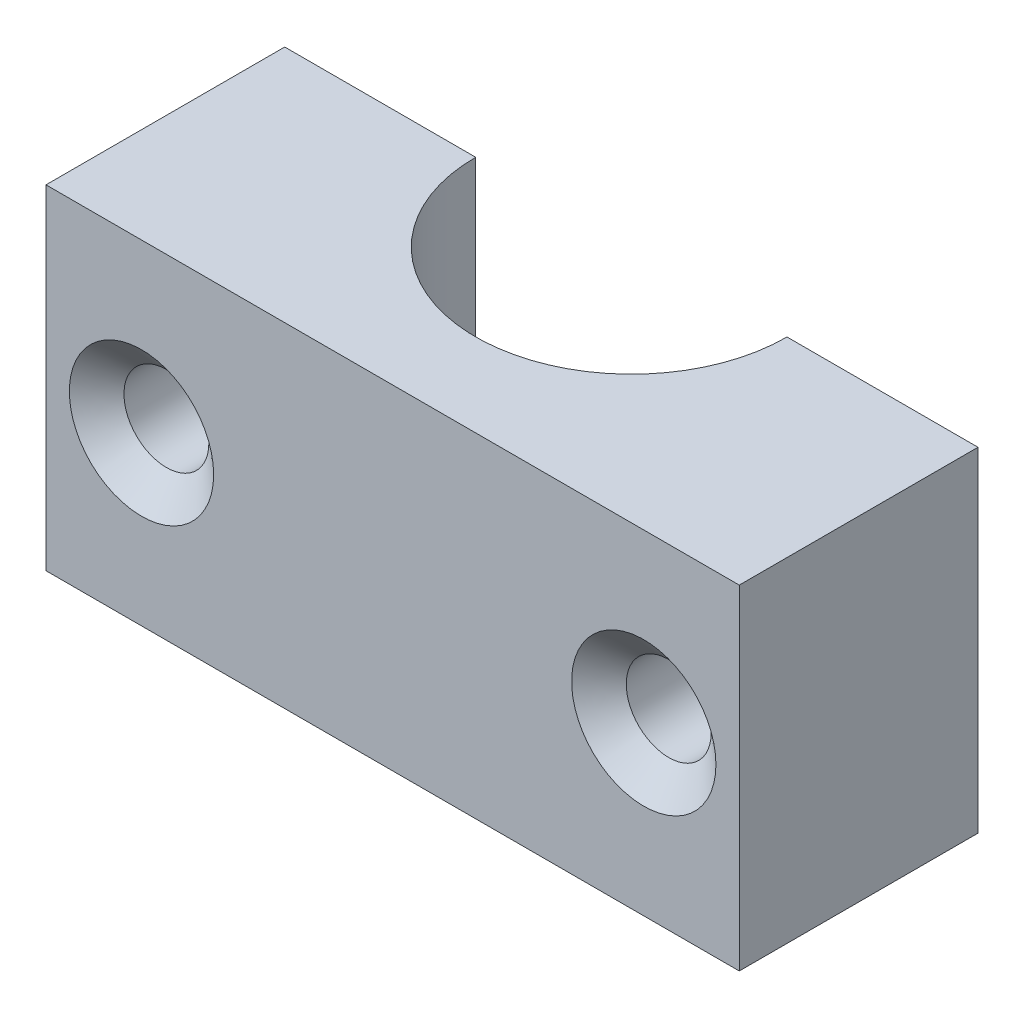
ISO-10303-21;
HEADER;
FILE_DESCRIPTION(('STEP AP214'),'2;1');
FILE_NAME('part.step','',(''),(''),'','','');
FILE_SCHEMA(('AUTOMOTIVE_DESIGN { 1 0 10303 214 1 1 1 1 }'));
ENDSEC;
DATA;
#1=APPLICATION_CONTEXT('core data for automotive mechanical design processes');
#2=APPLICATION_PROTOCOL_DEFINITION('international standard','automotive_design',2000,#1);
#3=PRODUCT_CONTEXT('',#1,'mechanical');
#4=PRODUCT('Part','Part','',(#3));
#5=PRODUCT_RELATED_PRODUCT_CATEGORY('part','',(#4));
#6=PRODUCT_DEFINITION_FORMATION('','',#4);
#7=PRODUCT_DEFINITION_CONTEXT('part definition',#1,'design');
#8=PRODUCT_DEFINITION('design','',#6,#7);
#9=PRODUCT_DEFINITION_SHAPE('','',#8);
#10=(LENGTH_UNIT() NAMED_UNIT(*) SI_UNIT(.MILLI.,.METRE.));
#11=(NAMED_UNIT(*) PLANE_ANGLE_UNIT() SI_UNIT($,.RADIAN.));
#12=(NAMED_UNIT(*) SI_UNIT($,.STERADIAN.) SOLID_ANGLE_UNIT());
#13=UNCERTAINTY_MEASURE_WITH_UNIT(LENGTH_MEASURE(1.E-05),#10,'distance_accuracy_value','');
#14=(GEOMETRIC_REPRESENTATION_CONTEXT(3) GLOBAL_UNCERTAINTY_ASSIGNED_CONTEXT((#13)) GLOBAL_UNIT_ASSIGNED_CONTEXT((#10,
#11,#12)) REPRESENTATION_CONTEXT('',''));
#15=CARTESIAN_POINT('',(0.,0.,0.));
#16=DIRECTION('',(0.,0.,1.));
#17=DIRECTION('',(1.,0.,0.));
#18=AXIS2_PLACEMENT_3D('',#15,#16,#17);
#19=CARTESIAN_POINT('',(-7.26,7.,5.));
#20=DIRECTION('',(1.,0.,0.));
#21=DIRECTION('',(0.,0.,-1.));
#22=AXIS2_PLACEMENT_3D('',#19,#20,#21);
#23=PLANE('',#22);
#24=DIRECTION('',(0.,0.,1.));
#25=VECTOR('',#24,1.);
#26=CARTESIAN_POINT('',(-7.26,0.,5.));
#27=LINE('',#26,#25);
#28=CARTESIAN_POINT('',(-7.26,0.,0.));
#29=VERTEX_POINT('',#28);
#30=CARTESIAN_POINT('',(-7.26,0.,5.));
#31=VERTEX_POINT('',#30);
#32=EDGE_CURVE('E115',#29,#31,#27,.T.);
#33=ORIENTED_EDGE('',*,*,#32,.T.);
#34=DIRECTION('',(0.,-1.,0.));
#35=VECTOR('',#34,1.);
#36=CARTESIAN_POINT('',(-7.26,7.,5.));
#37=LINE('',#36,#35);
#38=CARTESIAN_POINT('',(-7.26,7.,5.));
#39=VERTEX_POINT('',#38);
#40=EDGE_CURVE('E11',#39,#31,#37,.T.);
#41=ORIENTED_EDGE('',*,*,#40,.F.);
#42=DIRECTION('',(0.,0.,1.));
#43=VECTOR('',#42,1.);
#44=CARTESIAN_POINT('',(-7.26,7.,5.));
#45=LINE('',#44,#43);
#46=CARTESIAN_POINT('',(-7.26,7.,0.));
#47=VERTEX_POINT('',#46);
#48=EDGE_CURVE('E126',#47,#39,#45,.T.);
#49=ORIENTED_EDGE('',*,*,#48,.F.);
#50=DIRECTION('',(0.,-1.,0.));
#51=VECTOR('',#50,1.);
#52=CARTESIAN_POINT('',(-7.26,7.,0.));
#53=LINE('',#52,#51);
#54=EDGE_CURVE('E111',#47,#29,#53,.T.);
#55=ORIENTED_EDGE('',*,*,#54,.T.);
#56=EDGE_LOOP('',(#33,#41,#49,#55));
#57=FACE_BOUND('',#56,.T.);
#58=ADVANCED_FACE('F31',(#57),#23,.F.);
#59=CARTESIAN_POINT('',(7.26,7.,5.));
#60=DIRECTION('',(0.,0.,-1.));
#61=DIRECTION('',(-1.,0.,0.));
#62=AXIS2_PLACEMENT_3D('',#59,#60,#61);
#63=PLANE('',#62);
#64=CARTESIAN_POINT('',(-5.26,3.5,5.));
#65=DIRECTION('',(0.,0.,1.));
#66=DIRECTION('',(1.,0.,0.));
#67=AXIS2_PLACEMENT_3D('',#64,#65,#66);
#68=CIRCLE('',#67,1.5113);
#69=CARTESIAN_POINT('',(-3.7487,3.5,5.));
#70=VERTEX_POINT('',#69);
#71=EDGE_CURVE('E186',#70,#70,#68,.T.);
#72=ORIENTED_EDGE('',*,*,#71,.F.);
#73=EDGE_LOOP('',(#72));
#74=FACE_BOUND('',#73,.T.);
#75=CARTESIAN_POINT('',(5.26,3.5,5.));
#76=DIRECTION('',(0.,0.,1.));
#77=DIRECTION('',(1.,0.,0.));
#78=AXIS2_PLACEMENT_3D('',#75,#76,#77);
#79=CIRCLE('',#78,1.5113);
#80=CARTESIAN_POINT('',(6.7713,3.5,5.));
#81=VERTEX_POINT('',#80);
#82=EDGE_CURVE('E174',#81,#81,#79,.T.);
#83=ORIENTED_EDGE('',*,*,#82,.F.);
#84=EDGE_LOOP('',(#83));
#85=FACE_BOUND('',#84,.T.);
#86=DIRECTION('',(1.,0.,0.));
#87=VECTOR('',#86,1.);
#88=CARTESIAN_POINT('',(7.26,0.,5.));
#89=LINE('',#88,#87);
#90=CARTESIAN_POINT('',(7.26,0.,5.));
#91=VERTEX_POINT('',#90);
#92=EDGE_CURVE('E118',#31,#91,#89,.T.);
#93=ORIENTED_EDGE('',*,*,#92,.T.);
#94=DIRECTION('',(0.,-1.,0.));
#95=VECTOR('',#94,1.);
#96=CARTESIAN_POINT('',(7.26,7.,5.));
#97=LINE('',#96,#95);
#98=CARTESIAN_POINT('',(7.26,7.,5.));
#99=VERTEX_POINT('',#98);
#100=EDGE_CURVE('E39',#99,#91,#97,.T.);
#101=ORIENTED_EDGE('',*,*,#100,.F.);
#102=DIRECTION('',(1.,0.,0.));
#103=VECTOR('',#102,1.);
#104=CARTESIAN_POINT('',(7.26,7.,5.));
#105=LINE('',#104,#103);
#106=EDGE_CURVE('E84',#39,#99,#105,.T.);
#107=ORIENTED_EDGE('',*,*,#106,.F.);
#108=ORIENTED_EDGE('',*,*,#40,.T.);
#109=EDGE_LOOP('',(#93,#101,#107,#108));
#110=FACE_BOUND('',#109,.T.);
#111=ADVANCED_FACE('F152',(#74,#85,#110),#63,.F.);
#112=CARTESIAN_POINT('',(7.26,7.,0.));
#113=DIRECTION('',(-1.,0.,0.));
#114=DIRECTION('',(0.,0.,1.));
#115=AXIS2_PLACEMENT_3D('',#112,#113,#114);
#116=PLANE('',#115);
#117=DIRECTION('',(0.,0.,-1.));
#118=VECTOR('',#117,1.);
#119=CARTESIAN_POINT('',(7.26,0.,0.));
#120=LINE('',#119,#118);
#121=CARTESIAN_POINT('',(7.26,0.,0.));
#122=VERTEX_POINT('',#121);
#123=EDGE_CURVE('E121',#91,#122,#120,.T.);
#124=ORIENTED_EDGE('',*,*,#123,.T.);
#125=DIRECTION('',(0.,-1.,0.));
#126=VECTOR('',#125,1.);
#127=CARTESIAN_POINT('',(7.26,7.,0.));
#128=LINE('',#127,#126);
#129=CARTESIAN_POINT('',(7.26,7.,0.));
#130=VERTEX_POINT('',#129);
#131=EDGE_CURVE('E106',#130,#122,#128,.T.);
#132=ORIENTED_EDGE('',*,*,#131,.F.);
#133=DIRECTION('',(0.,0.,-1.));
#134=VECTOR('',#133,1.);
#135=CARTESIAN_POINT('',(7.26,7.,0.));
#136=LINE('',#135,#134);
#137=EDGE_CURVE('E97',#99,#130,#136,.T.);
#138=ORIENTED_EDGE('',*,*,#137,.F.);
#139=ORIENTED_EDGE('',*,*,#100,.T.);
#140=EDGE_LOOP('',(#124,#132,#138,#139));
#141=FACE_BOUND('',#140,.T.);
#142=ADVANCED_FACE('F132',(#141),#116,.F.);
#143=CARTESIAN_POINT('',(3.26,7.,0.));
#144=DIRECTION('',(0.,0.,1.));
#145=DIRECTION('',(1.,0.,0.));
#146=AXIS2_PLACEMENT_3D('',#143,#144,#145);
#147=PLANE('',#146);
#148=CARTESIAN_POINT('',(5.26,3.5,0.));
#149=DIRECTION('',(0.,0.,1.));
#150=DIRECTION('',(1.,0.,0.));
#151=AXIS2_PLACEMENT_3D('',#148,#149,#150);
#152=CIRCLE('',#151,0.888999999999999);
#153=CARTESIAN_POINT('',(6.149,3.5,0.));
#154=VERTEX_POINT('',#153);
#155=EDGE_CURVE('E119',#154,#154,#152,.T.);
#156=ORIENTED_EDGE('',*,*,#155,.T.);
#157=EDGE_LOOP('',(#156));
#158=FACE_BOUND('',#157,.T.);
#159=DIRECTION('',(-1.,0.,0.));
#160=VECTOR('',#159,1.);
#161=CARTESIAN_POINT('',(3.26,0.,0.));
#162=LINE('',#161,#160);
#163=CARTESIAN_POINT('',(3.26,0.,0.));
#164=VERTEX_POINT('',#163);
#165=EDGE_CURVE('E105',#122,#164,#162,.T.);
#166=ORIENTED_EDGE('',*,*,#165,.T.);
#167=DIRECTION('',(0.,-1.,0.));
#168=VECTOR('',#167,1.);
#169=CARTESIAN_POINT('',(3.26,7.,0.));
#170=LINE('',#169,#168);
#171=CARTESIAN_POINT('',(3.26,7.,0.));
#172=VERTEX_POINT('',#171);
#173=EDGE_CURVE('E102',#172,#164,#170,.T.);
#174=ORIENTED_EDGE('',*,*,#173,.F.);
#175=DIRECTION('',(-1.,0.,0.));
#176=VECTOR('',#175,1.);
#177=CARTESIAN_POINT('',(3.26,7.,0.));
#178=LINE('',#177,#176);
#179=EDGE_CURVE('E91',#130,#172,#178,.T.);
#180=ORIENTED_EDGE('',*,*,#179,.F.);
#181=ORIENTED_EDGE('',*,*,#131,.T.);
#182=EDGE_LOOP('',(#166,#174,#180,#181));
#183=FACE_BOUND('',#182,.T.);
#184=ADVANCED_FACE('F103',(#158,#183),#147,.F.);
#185=CARTESIAN_POINT('',(0.,7.,0.));
#186=DIRECTION('',(0.,-1.,0.));
#187=DIRECTION('',(0.,0.,-1.));
#188=AXIS2_PLACEMENT_3D('',#185,#186,#187);
#189=CYLINDRICAL_SURFACE('',#188,3.26);
#190=CARTESIAN_POINT('',(0.,0.,0.));
#191=DIRECTION('',(0.,-1.,0.));
#192=DIRECTION('',(0.,0.,1.));
#193=AXIS2_PLACEMENT_3D('',#190,#191,#192);
#194=CIRCLE('',#193,3.26);
#195=CARTESIAN_POINT('',(-3.26,0.,0.));
#196=VERTEX_POINT('',#195);
#197=EDGE_CURVE('E70',#164,#196,#194,.T.);
#198=ORIENTED_EDGE('',*,*,#197,.T.);
#199=DIRECTION('',(0.,-1.,0.));
#200=VECTOR('',#199,1.);
#201=CARTESIAN_POINT('',(-3.26,7.,0.));
#202=LINE('',#201,#200);
#203=CARTESIAN_POINT('',(-3.26,7.,0.));
#204=VERTEX_POINT('',#203);
#205=EDGE_CURVE('E107',#204,#196,#202,.T.);
#206=ORIENTED_EDGE('',*,*,#205,.F.);
#207=CARTESIAN_POINT('',(0.,7.,0.));
#208=DIRECTION('',(0.,-1.,0.));
#209=DIRECTION('',(0.,0.,1.));
#210=AXIS2_PLACEMENT_3D('',#207,#208,#209);
#211=CIRCLE('',#210,3.26);
#212=EDGE_CURVE('E95',#172,#204,#211,.T.);
#213=ORIENTED_EDGE('',*,*,#212,.F.);
#214=ORIENTED_EDGE('',*,*,#173,.T.);
#215=EDGE_LOOP('',(#198,#206,#213,#214));
#216=FACE_BOUND('',#215,.T.);
#217=ADVANCED_FACE('F109',(#216),#189,.F.);
#218=CARTESIAN_POINT('',(-7.26,7.,0.));
#219=DIRECTION('',(0.,0.,1.));
#220=DIRECTION('',(1.,0.,0.));
#221=AXIS2_PLACEMENT_3D('',#218,#219,#220);
#222=PLANE('',#221);
#223=CARTESIAN_POINT('',(-5.26,3.5,0.));
#224=DIRECTION('',(0.,0.,1.));
#225=DIRECTION('',(1.,0.,0.));
#226=AXIS2_PLACEMENT_3D('',#223,#224,#225);
#227=CIRCLE('',#226,0.888999999999999);
#228=CARTESIAN_POINT('',(-4.371,3.5,0.));
#229=VERTEX_POINT('',#228);
#230=EDGE_CURVE('E181',#229,#229,#227,.T.);
#231=ORIENTED_EDGE('',*,*,#230,.T.);
#232=EDGE_LOOP('',(#231));
#233=FACE_BOUND('',#232,.T.);
#234=DIRECTION('',(-1.,0.,0.));
#235=VECTOR('',#234,1.);
#236=CARTESIAN_POINT('',(-7.26,0.,0.));
#237=LINE('',#236,#235);
#238=EDGE_CURVE('E76',#196,#29,#237,.T.);
#239=ORIENTED_EDGE('',*,*,#238,.T.);
#240=ORIENTED_EDGE('',*,*,#54,.F.);
#241=DIRECTION('',(-1.,0.,0.));
#242=VECTOR('',#241,1.);
#243=CARTESIAN_POINT('',(-7.26,7.,0.));
#244=LINE('',#243,#242);
#245=EDGE_CURVE('E47',#204,#47,#244,.T.);
#246=ORIENTED_EDGE('',*,*,#245,.F.);
#247=ORIENTED_EDGE('',*,*,#205,.T.);
#248=EDGE_LOOP('',(#239,#240,#246,#247));
#249=FACE_BOUND('',#248,.T.);
#250=ADVANCED_FACE('F139',(#233,#249),#222,.F.);
#251=CARTESIAN_POINT('',(0.,7.,0.));
#252=DIRECTION('',(0.,1.,0.));
#253=DIRECTION('',(0.,0.,1.));
#254=AXIS2_PLACEMENT_3D('',#251,#252,#253);
#255=PLANE('',#254);
#256=ORIENTED_EDGE('',*,*,#48,.T.);
#257=ORIENTED_EDGE('',*,*,#106,.T.);
#258=ORIENTED_EDGE('',*,*,#137,.T.);
#259=ORIENTED_EDGE('',*,*,#179,.T.);
#260=ORIENTED_EDGE('',*,*,#212,.T.);
#261=ORIENTED_EDGE('',*,*,#245,.T.);
#262=EDGE_LOOP('',(#256,#257,#258,#259,#260,#261));
#263=FACE_BOUND('',#262,.T.);
#264=ADVANCED_FACE('F93',(#263),#255,.T.);
#265=CARTESIAN_POINT('',(0.,0.,0.));
#266=DIRECTION('',(0.,1.,0.));
#267=DIRECTION('',(0.,0.,1.));
#268=AXIS2_PLACEMENT_3D('',#265,#266,#267);
#269=PLANE('',#268);
#270=ORIENTED_EDGE('',*,*,#32,.F.);
#271=ORIENTED_EDGE('',*,*,#238,.F.);
#272=ORIENTED_EDGE('',*,*,#197,.F.);
#273=ORIENTED_EDGE('',*,*,#165,.F.);
#274=ORIENTED_EDGE('',*,*,#123,.F.);
#275=ORIENTED_EDGE('',*,*,#92,.F.);
#276=EDGE_LOOP('',(#270,#271,#272,#273,#274,#275));
#277=FACE_BOUND('',#276,.T.);
#278=ADVANCED_FACE('F135',(#277),#269,.F.);
#279=CARTESIAN_POINT('',(5.26,3.5,5.));
#280=DIRECTION('',(0.,0.,1.));
#281=DIRECTION('',(1.,0.,0.));
#282=AXIS2_PLACEMENT_3D('',#279,#280,#281);
#283=CYLINDRICAL_SURFACE('',#282,0.888999999999999);
#284=ORIENTED_EDGE('',*,*,#155,.F.);
#285=EDGE_LOOP('',(#284));
#286=FACE_BOUND('',#285,.T.);
#287=CARTESIAN_POINT('',(5.26,3.5,4.47782829951838));
#288=DIRECTION('',(0.,0.,1.));
#289=DIRECTION('',(1.,0.,0.));
#290=AXIS2_PLACEMENT_3D('',#287,#288,#289);
#291=CIRCLE('',#290,0.888999999999999);
#292=CARTESIAN_POINT('',(6.149,3.5,4.47782829951838));
#293=VERTEX_POINT('',#292);
#294=EDGE_CURVE('E171',#293,#293,#291,.T.);
#295=ORIENTED_EDGE('',*,*,#294,.T.);
#296=EDGE_LOOP('',(#295));
#297=FACE_BOUND('',#296,.T.);
#298=ADVANCED_FACE('F204',(#286,#297),#283,.F.);
#299=CARTESIAN_POINT('',(5.26,3.5,5.));
#300=DIRECTION('',(0.,0.,1.));
#301=DIRECTION('',(1.,0.,0.));
#302=AXIS2_PLACEMENT_3D('',#299,#300,#301);
#303=CONICAL_SURFACE('',#302,1.5113,0.872664625997161);
#304=ORIENTED_EDGE('',*,*,#294,.F.);
#305=EDGE_LOOP('',(#304));
#306=FACE_BOUND('',#305,.T.);
#307=ORIENTED_EDGE('',*,*,#82,.T.);
#308=EDGE_LOOP('',(#307));
#309=FACE_BOUND('',#308,.T.);
#310=ADVANCED_FACE('F197',(#306,#309),#303,.F.);
#311=CARTESIAN_POINT('',(-5.26,3.5,5.));
#312=DIRECTION('',(0.,0.,1.));
#313=DIRECTION('',(1.,0.,0.));
#314=AXIS2_PLACEMENT_3D('',#311,#312,#313);
#315=CYLINDRICAL_SURFACE('',#314,0.888999999999999);
#316=ORIENTED_EDGE('',*,*,#230,.F.);
#317=EDGE_LOOP('',(#316));
#318=FACE_BOUND('',#317,.T.);
#319=CARTESIAN_POINT('',(-5.26,3.5,4.47782829951838));
#320=DIRECTION('',(0.,0.,1.));
#321=DIRECTION('',(1.,0.,0.));
#322=AXIS2_PLACEMENT_3D('',#319,#320,#321);
#323=CIRCLE('',#322,0.888999999999999);
#324=CARTESIAN_POINT('',(-4.371,3.5,4.47782829951838));
#325=VERTEX_POINT('',#324);
#326=EDGE_CURVE('E183',#325,#325,#323,.T.);
#327=ORIENTED_EDGE('',*,*,#326,.T.);
#328=EDGE_LOOP('',(#327));
#329=FACE_BOUND('',#328,.T.);
#330=ADVANCED_FACE('F191',(#318,#329),#315,.F.);
#331=CARTESIAN_POINT('',(-5.26,3.5,5.));
#332=DIRECTION('',(0.,0.,1.));
#333=DIRECTION('',(1.,0.,0.));
#334=AXIS2_PLACEMENT_3D('',#331,#332,#333);
#335=CONICAL_SURFACE('',#334,1.5113,0.872664625997161);
#336=ORIENTED_EDGE('',*,*,#326,.F.);
#337=EDGE_LOOP('',(#336));
#338=FACE_BOUND('',#337,.T.);
#339=ORIENTED_EDGE('',*,*,#71,.T.);
#340=EDGE_LOOP('',(#339));
#341=FACE_BOUND('',#340,.T.);
#342=ADVANCED_FACE('F189',(#338,#341),#335,.F.);
#343=CLOSED_SHELL('',(#58,#111,#142,#184,#217,#250,#264,#278,#298,#310,#330,#342));
#344=MANIFOLD_SOLID_BREP('B2',#343);
#345=ADVANCED_BREP_SHAPE_REPRESENTATION('',(#18,#344),#14);
#346=SHAPE_DEFINITION_REPRESENTATION(#9,#345);
ENDSEC;
END-ISO-10303-21;
